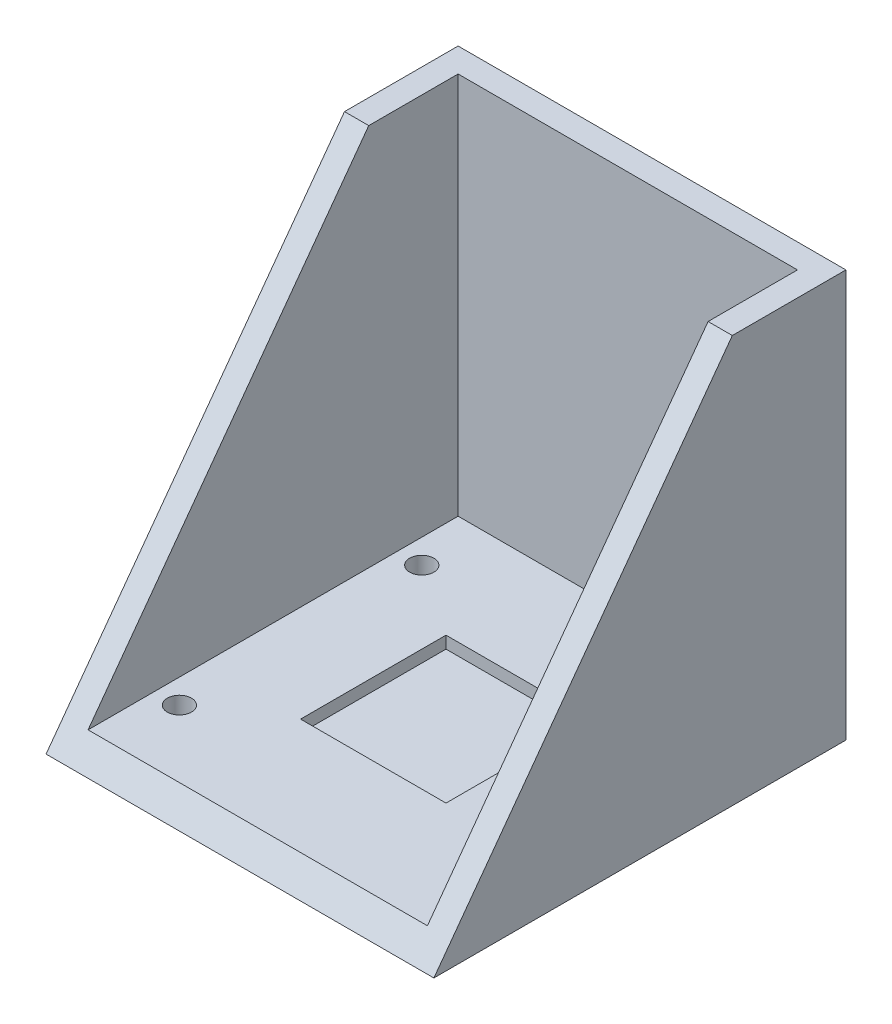
ISO-10303-21;
HEADER;
FILE_DESCRIPTION(('STEP AP214'),'2;1');
FILE_NAME('part.step','',(''),(''),'','','');
FILE_SCHEMA(('AUTOMOTIVE_DESIGN { 1 0 10303 214 1 1 1 1 }'));
ENDSEC;
DATA;
#1=APPLICATION_CONTEXT('core data for automotive mechanical design processes');
#2=APPLICATION_PROTOCOL_DEFINITION('international standard','automotive_design',2000,#1);
#3=PRODUCT_CONTEXT('',#1,'mechanical');
#4=PRODUCT('Part','Part','',(#3));
#5=PRODUCT_RELATED_PRODUCT_CATEGORY('part','',(#4));
#6=PRODUCT_DEFINITION_FORMATION('','',#4);
#7=PRODUCT_DEFINITION_CONTEXT('part definition',#1,'design');
#8=PRODUCT_DEFINITION('design','',#6,#7);
#9=PRODUCT_DEFINITION_SHAPE('','',#8);
#10=(LENGTH_UNIT() NAMED_UNIT(*) SI_UNIT(.MILLI.,.METRE.));
#11=(NAMED_UNIT(*) PLANE_ANGLE_UNIT() SI_UNIT($,.RADIAN.));
#12=(NAMED_UNIT(*) SI_UNIT($,.STERADIAN.) SOLID_ANGLE_UNIT());
#13=UNCERTAINTY_MEASURE_WITH_UNIT(LENGTH_MEASURE(1.E-05),#10,'distance_accuracy_value','');
#14=(GEOMETRIC_REPRESENTATION_CONTEXT(3) GLOBAL_UNCERTAINTY_ASSIGNED_CONTEXT((#13)) GLOBAL_UNIT_ASSIGNED_CONTEXT((#10,
#11,#12)) REPRESENTATION_CONTEXT('',''));
#15=CARTESIAN_POINT('',(0.,0.,0.));
#16=DIRECTION('',(0.,0.,1.));
#17=DIRECTION('',(1.,0.,0.));
#18=AXIS2_PLACEMENT_3D('',#15,#16,#17);
#19=CARTESIAN_POINT('',(0.,213.36,0.));
#20=DIRECTION('',(0.,-1.,0.));
#21=DIRECTION('',(0.,0.,-1.));
#22=AXIS2_PLACEMENT_3D('',#19,#20,#21);
#23=PLANE('',#22);
#24=DIRECTION('',(0.,0.,1.));
#25=VECTOR('',#24,1.);
#26=CARTESIAN_POINT('',(-101.6,213.36,107.95));
#27=LINE('',#26,#25);
#28=CARTESIAN_POINT('',(-101.6,213.36,-107.95));
#29=VERTEX_POINT('',#28);
#30=CARTESIAN_POINT('',(-101.6,213.36,-48.4218480796323));
#31=VERTEX_POINT('',#30);
#32=EDGE_CURVE('E151',#29,#31,#27,.T.);
#33=ORIENTED_EDGE('',*,*,#32,.T.);
#34=DIRECTION('',(1.,0.,0.));
#35=VECTOR('',#34,1.);
#36=CARTESIAN_POINT('',(-101.6,213.36,-48.4218480796323));
#37=LINE('',#36,#35);
#38=CARTESIAN_POINT('',(-88.8999999999999,213.36,-48.4218480796323));
#39=VERTEX_POINT('',#38);
#40=EDGE_CURVE('E125',#31,#39,#37,.T.);
#41=ORIENTED_EDGE('',*,*,#40,.T.);
#42=DIRECTION('',(0.,0.,1.));
#43=VECTOR('',#42,1.);
#44=CARTESIAN_POINT('',(-88.8999999999999,213.36,0.));
#45=LINE('',#44,#43);
#46=CARTESIAN_POINT('',(-88.8999999999999,213.36,-95.25));
#47=VERTEX_POINT('',#46);
#48=EDGE_CURVE('E167',#47,#39,#45,.T.);
#49=ORIENTED_EDGE('',*,*,#48,.F.);
#50=DIRECTION('',(-1.,0.,0.));
#51=VECTOR('',#50,1.);
#52=CARTESIAN_POINT('',(0.,213.36,-95.25));
#53=LINE('',#52,#51);
#54=CARTESIAN_POINT('',(88.9,213.36,-95.25));
#55=VERTEX_POINT('',#54);
#56=EDGE_CURVE('E170',#55,#47,#53,.T.);
#57=ORIENTED_EDGE('',*,*,#56,.F.);
#58=DIRECTION('',(0.,0.,-1.));
#59=VECTOR('',#58,1.);
#60=CARTESIAN_POINT('',(88.9,213.36,0.));
#61=LINE('',#60,#59);
#62=CARTESIAN_POINT('',(88.9,213.36,-48.4218480796323));
#63=VERTEX_POINT('',#62);
#64=EDGE_CURVE('E173',#63,#55,#61,.T.);
#65=ORIENTED_EDGE('',*,*,#64,.F.);
#66=CARTESIAN_POINT('',(101.6,213.36,-48.4218480796323));
#67=VERTEX_POINT('',#66);
#68=EDGE_CURVE('E129',#63,#67,#37,.T.);
#69=ORIENTED_EDGE('',*,*,#68,.T.);
#70=DIRECTION('',(0.,0.,-1.));
#71=VECTOR('',#70,1.);
#72=CARTESIAN_POINT('',(101.6,213.36,107.95));
#73=LINE('',#72,#71);
#74=CARTESIAN_POINT('',(101.6,213.36,-107.95));
#75=VERTEX_POINT('',#74);
#76=EDGE_CURVE('E145',#67,#75,#73,.T.);
#77=ORIENTED_EDGE('',*,*,#76,.T.);
#78=DIRECTION('',(-1.,0.,0.));
#79=VECTOR('',#78,1.);
#80=CARTESIAN_POINT('',(-101.6,213.36,-107.95));
#81=LINE('',#80,#79);
#82=EDGE_CURVE('E147',#75,#29,#81,.T.);
#83=ORIENTED_EDGE('',*,*,#82,.T.);
#84=EDGE_LOOP('',(#33,#41,#49,#57,#65,#69,#77,#83));
#85=FACE_BOUND('',#84,.T.);
#86=ADVANCED_FACE('F32',(#85),#23,.F.);
#87=CARTESIAN_POINT('',(101.6,213.36,107.95));
#88=DIRECTION('',(-1.,0.,0.));
#89=DIRECTION('',(0.,0.,1.));
#90=AXIS2_PLACEMENT_3D('',#87,#88,#89);
#91=PLANE('',#90);
#92=ORIENTED_EDGE('',*,*,#76,.F.);
#93=DIRECTION('',(0.,0.806571091671892,-0.591137102607519));
#94=VECTOR('',#93,1.);
#95=CARTESIAN_POINT('',(101.6,213.36,-48.4218480796323));
#96=LINE('',#95,#94);
#97=CARTESIAN_POINT('',(101.6,0.,107.95));
#98=VERTEX_POINT('',#97);
#99=EDGE_CURVE('E130',#98,#67,#96,.T.);
#100=ORIENTED_EDGE('',*,*,#99,.F.);
#101=DIRECTION('',(0.,0.,-1.));
#102=VECTOR('',#101,1.);
#103=CARTESIAN_POINT('',(101.6,0.,107.95));
#104=LINE('',#103,#102);
#105=CARTESIAN_POINT('',(101.6,0.,-107.95));
#106=VERTEX_POINT('',#105);
#107=EDGE_CURVE('E144',#98,#106,#104,.T.);
#108=ORIENTED_EDGE('',*,*,#107,.T.);
#109=DIRECTION('',(0.,-1.,0.));
#110=VECTOR('',#109,1.);
#111=CARTESIAN_POINT('',(101.6,213.36,-107.95));
#112=LINE('',#111,#110);
#113=EDGE_CURVE('E40',#75,#106,#112,.T.);
#114=ORIENTED_EDGE('',*,*,#113,.F.);
#115=EDGE_LOOP('',(#92,#100,#108,#114));
#116=FACE_BOUND('',#115,.T.);
#117=ADVANCED_FACE('F34',(#116),#91,.F.);
#118=CARTESIAN_POINT('',(-101.6,213.36,-107.95));
#119=DIRECTION('',(0.,0.,1.));
#120=DIRECTION('',(1.,0.,0.));
#121=AXIS2_PLACEMENT_3D('',#118,#119,#120);
#122=PLANE('',#121);
#123=DIRECTION('',(-1.,0.,0.));
#124=VECTOR('',#123,1.);
#125=CARTESIAN_POINT('',(-101.6,0.,-107.95));
#126=LINE('',#125,#124);
#127=CARTESIAN_POINT('',(-101.6,0.,-107.95));
#128=VERTEX_POINT('',#127);
#129=EDGE_CURVE('E139',#106,#128,#126,.T.);
#130=ORIENTED_EDGE('',*,*,#129,.T.);
#131=DIRECTION('',(0.,-1.,0.));
#132=VECTOR('',#131,1.);
#133=CARTESIAN_POINT('',(-101.6,213.36,-107.95));
#134=LINE('',#133,#132);
#135=EDGE_CURVE('E137',#29,#128,#134,.T.);
#136=ORIENTED_EDGE('',*,*,#135,.F.);
#137=ORIENTED_EDGE('',*,*,#82,.F.);
#138=ORIENTED_EDGE('',*,*,#113,.T.);
#139=EDGE_LOOP('',(#130,#136,#137,#138));
#140=FACE_BOUND('',#139,.T.);
#141=ADVANCED_FACE('F156',(#140),#122,.F.);
#142=CARTESIAN_POINT('',(-101.6,213.36,107.95));
#143=DIRECTION('',(1.,0.,0.));
#144=DIRECTION('',(0.,0.,-1.));
#145=AXIS2_PLACEMENT_3D('',#142,#143,#144);
#146=PLANE('',#145);
#147=DIRECTION('',(0.,0.,1.));
#148=VECTOR('',#147,1.);
#149=CARTESIAN_POINT('',(-101.6,0.,107.95));
#150=LINE('',#149,#148);
#151=CARTESIAN_POINT('',(-101.6,0.,107.95));
#152=VERTEX_POINT('',#151);
#153=EDGE_CURVE('E134',#128,#152,#150,.T.);
#154=ORIENTED_EDGE('',*,*,#153,.T.);
#155=DIRECTION('',(0.,0.806571091671892,-0.591137102607519));
#156=VECTOR('',#155,1.);
#157=CARTESIAN_POINT('',(-101.6,213.36,-48.4218480796323));
#158=LINE('',#157,#156);
#159=EDGE_CURVE('E118',#152,#31,#158,.T.);
#160=ORIENTED_EDGE('',*,*,#159,.T.);
#161=ORIENTED_EDGE('',*,*,#32,.F.);
#162=ORIENTED_EDGE('',*,*,#135,.T.);
#163=EDGE_LOOP('',(#154,#160,#161,#162));
#164=FACE_BOUND('',#163,.T.);
#165=ADVANCED_FACE('F135',(#164),#146,.F.);
#166=CARTESIAN_POINT('',(0.,0.,0.));
#167=DIRECTION('',(0.,-1.,0.));
#168=DIRECTION('',(0.,0.,-1.));
#169=AXIS2_PLACEMENT_3D('',#166,#167,#168);
#170=PLANE('',#169);
#171=CARTESIAN_POINT('',(76.2,0.,63.5));
#172=DIRECTION('',(0.,1.,0.));
#173=DIRECTION('',(0.,0.,1.));
#174=AXIS2_PLACEMENT_3D('',#171,#172,#173);
#175=CIRCLE('',#174,6.35);
#176=CARTESIAN_POINT('',(76.2,0.,69.85));
#177=VERTEX_POINT('',#176);
#178=EDGE_CURVE('E230',#177,#177,#175,.T.);
#179=ORIENTED_EDGE('',*,*,#178,.T.);
#180=EDGE_LOOP('',(#179));
#181=FACE_BOUND('',#180,.T.);
#182=CARTESIAN_POINT('',(76.2,0.,-63.5));
#183=DIRECTION('',(0.,1.,0.));
#184=DIRECTION('',(0.,0.,1.));
#185=AXIS2_PLACEMENT_3D('',#182,#183,#184);
#186=CIRCLE('',#185,6.34999999999999);
#187=CARTESIAN_POINT('',(76.2,0.,-57.15));
#188=VERTEX_POINT('',#187);
#189=EDGE_CURVE('E224',#188,#188,#186,.T.);
#190=ORIENTED_EDGE('',*,*,#189,.T.);
#191=EDGE_LOOP('',(#190));
#192=FACE_BOUND('',#191,.T.);
#193=CARTESIAN_POINT('',(-76.2,0.,63.5));
#194=DIRECTION('',(0.,1.,0.));
#195=DIRECTION('',(0.,0.,1.));
#196=AXIS2_PLACEMENT_3D('',#193,#194,#195);
#197=CIRCLE('',#196,6.35);
#198=CARTESIAN_POINT('',(-76.2,0.,69.85));
#199=VERTEX_POINT('',#198);
#200=EDGE_CURVE('E218',#199,#199,#197,.T.);
#201=ORIENTED_EDGE('',*,*,#200,.T.);
#202=EDGE_LOOP('',(#201));
#203=FACE_BOUND('',#202,.T.);
#204=CARTESIAN_POINT('',(-76.2,0.,-63.5));
#205=DIRECTION('',(0.,1.,0.));
#206=DIRECTION('',(0.,0.,1.));
#207=AXIS2_PLACEMENT_3D('',#204,#205,#206);
#208=CIRCLE('',#207,6.34999999999999);
#209=CARTESIAN_POINT('',(-76.2,0.,-57.15));
#210=VERTEX_POINT('',#209);
#211=EDGE_CURVE('E204',#210,#210,#208,.T.);
#212=ORIENTED_EDGE('',*,*,#211,.T.);
#213=EDGE_LOOP('',(#212));
#214=FACE_BOUND('',#213,.T.);
#215=ORIENTED_EDGE('',*,*,#107,.F.);
#216=DIRECTION('',(1.,0.,0.));
#217=VECTOR('',#216,1.);
#218=CARTESIAN_POINT('',(-101.6,0.,107.95));
#219=LINE('',#218,#217);
#220=EDGE_CURVE('E122',#152,#98,#219,.T.);
#221=ORIENTED_EDGE('',*,*,#220,.F.);
#222=ORIENTED_EDGE('',*,*,#153,.F.);
#223=ORIENTED_EDGE('',*,*,#129,.F.);
#224=EDGE_LOOP('',(#215,#221,#222,#223));
#225=FACE_BOUND('',#224,.T.);
#226=ADVANCED_FACE('F142',(#181,#192,#203,#214,#225),#170,.T.);
#227=CARTESIAN_POINT('',(88.9,213.36,107.95));
#228=DIRECTION('',(-1.,0.,0.));
#229=DIRECTION('',(0.,0.,1.));
#230=AXIS2_PLACEMENT_3D('',#227,#228,#229);
#231=PLANE('',#230);
#232=DIRECTION('',(0.,-0.806571091671892,0.591137102607519));
#233=VECTOR('',#232,1.);
#234=CARTESIAN_POINT('',(88.9,138.802825714459,6.22121121276199));
#235=LINE('',#234,#233);
#236=CARTESIAN_POINT('',(88.9,12.7,98.6421519000219));
#237=VERTEX_POINT('',#236);
#238=EDGE_CURVE('E47',#63,#237,#235,.T.);
#239=ORIENTED_EDGE('',*,*,#238,.F.);
#240=ORIENTED_EDGE('',*,*,#64,.T.);
#241=DIRECTION('',(0.,-1.,0.));
#242=VECTOR('',#241,1.);
#243=CARTESIAN_POINT('',(88.9,213.36,-95.25));
#244=LINE('',#243,#242);
#245=CARTESIAN_POINT('',(88.9,12.7,-95.25));
#246=VERTEX_POINT('',#245);
#247=EDGE_CURVE('E159',#55,#246,#244,.T.);
#248=ORIENTED_EDGE('',*,*,#247,.T.);
#249=DIRECTION('',(0.,0.,-1.));
#250=VECTOR('',#249,1.);
#251=CARTESIAN_POINT('',(88.9,12.7,0.));
#252=LINE('',#251,#250);
#253=EDGE_CURVE('E181',#237,#246,#252,.T.);
#254=ORIENTED_EDGE('',*,*,#253,.F.);
#255=EDGE_LOOP('',(#239,#240,#248,#254));
#256=FACE_BOUND('',#255,.T.);
#257=ADVANCED_FACE('F249',(#256),#231,.T.);
#258=CARTESIAN_POINT('',(-101.6,213.36,-95.25));
#259=DIRECTION('',(0.,0.,1.));
#260=DIRECTION('',(1.,0.,0.));
#261=AXIS2_PLACEMENT_3D('',#258,#259,#260);
#262=PLANE('',#261);
#263=DIRECTION('',(-1.,0.,0.));
#264=VECTOR('',#263,1.);
#265=CARTESIAN_POINT('',(0.,12.7,-95.25));
#266=LINE('',#265,#264);
#267=CARTESIAN_POINT('',(-88.8999999999999,12.7,-95.25));
#268=VERTEX_POINT('',#267);
#269=EDGE_CURVE('E178',#246,#268,#266,.T.);
#270=ORIENTED_EDGE('',*,*,#269,.F.);
#271=ORIENTED_EDGE('',*,*,#247,.F.);
#272=ORIENTED_EDGE('',*,*,#56,.T.);
#273=DIRECTION('',(0.,-1.,0.));
#274=VECTOR('',#273,1.);
#275=CARTESIAN_POINT('',(-88.8999999999999,213.36,-95.25));
#276=LINE('',#275,#274);
#277=EDGE_CURVE('E162',#47,#268,#276,.T.);
#278=ORIENTED_EDGE('',*,*,#277,.T.);
#279=EDGE_LOOP('',(#270,#271,#272,#278));
#280=FACE_BOUND('',#279,.T.);
#281=ADVANCED_FACE('F253',(#280),#262,.T.);
#282=CARTESIAN_POINT('',(-88.8999999999999,213.36,107.95));
#283=DIRECTION('',(1.,0.,0.));
#284=DIRECTION('',(0.,0.,-1.));
#285=AXIS2_PLACEMENT_3D('',#282,#283,#284);
#286=PLANE('',#285);
#287=DIRECTION('',(0.,0.806571091671892,-0.591137102607519));
#288=VECTOR('',#287,1.);
#289=CARTESIAN_POINT('',(-88.8999999999999,138.802825714459,6.22121121276199));
#290=LINE('',#289,#288);
#291=CARTESIAN_POINT('',(-88.8999999999999,12.7,98.6421519000219));
#292=VERTEX_POINT('',#291);
#293=EDGE_CURVE('E239',#292,#39,#290,.T.);
#294=ORIENTED_EDGE('',*,*,#293,.F.);
#295=DIRECTION('',(0.,0.,1.));
#296=VECTOR('',#295,1.);
#297=CARTESIAN_POINT('',(-88.8999999999999,12.7,0.));
#298=LINE('',#297,#296);
#299=EDGE_CURVE('E175',#268,#292,#298,.T.);
#300=ORIENTED_EDGE('',*,*,#299,.F.);
#301=ORIENTED_EDGE('',*,*,#277,.F.);
#302=ORIENTED_EDGE('',*,*,#48,.T.);
#303=EDGE_LOOP('',(#294,#300,#301,#302));
#304=FACE_BOUND('',#303,.T.);
#305=ADVANCED_FACE('F259',(#304),#286,.T.);
#306=CARTESIAN_POINT('',(0.,12.7,0.));
#307=DIRECTION('',(0.,-1.,0.));
#308=DIRECTION('',(0.,0.,-1.));
#309=AXIS2_PLACEMENT_3D('',#306,#307,#308);
#310=PLANE('',#309);
#311=CARTESIAN_POINT('',(76.2,12.7,63.5));
#312=DIRECTION('',(0.,1.,0.));
#313=DIRECTION('',(0.,0.,1.));
#314=AXIS2_PLACEMENT_3D('',#311,#312,#313);
#315=CIRCLE('',#314,6.35);
#316=CARTESIAN_POINT('',(76.2,12.7,69.85));
#317=VERTEX_POINT('',#316);
#318=EDGE_CURVE('E233',#317,#317,#315,.T.);
#319=ORIENTED_EDGE('',*,*,#318,.F.);
#320=EDGE_LOOP('',(#319));
#321=FACE_BOUND('',#320,.T.);
#322=CARTESIAN_POINT('',(76.2,12.7,-63.5));
#323=DIRECTION('',(0.,1.,0.));
#324=DIRECTION('',(0.,0.,1.));
#325=AXIS2_PLACEMENT_3D('',#322,#323,#324);
#326=CIRCLE('',#325,6.34999999999999);
#327=CARTESIAN_POINT('',(76.2,12.7,-57.15));
#328=VERTEX_POINT('',#327);
#329=EDGE_CURVE('E227',#328,#328,#326,.T.);
#330=ORIENTED_EDGE('',*,*,#329,.F.);
#331=EDGE_LOOP('',(#330));
#332=FACE_BOUND('',#331,.T.);
#333=CARTESIAN_POINT('',(-76.2,12.7,63.5));
#334=DIRECTION('',(0.,1.,0.));
#335=DIRECTION('',(0.,0.,1.));
#336=AXIS2_PLACEMENT_3D('',#333,#334,#335);
#337=CIRCLE('',#336,6.35);
#338=CARTESIAN_POINT('',(-76.2,12.7,69.85));
#339=VERTEX_POINT('',#338);
#340=EDGE_CURVE('E221',#339,#339,#337,.T.);
#341=ORIENTED_EDGE('',*,*,#340,.F.);
#342=EDGE_LOOP('',(#341));
#343=FACE_BOUND('',#342,.T.);
#344=CARTESIAN_POINT('',(-76.2,12.7,-63.5));
#345=DIRECTION('',(0.,1.,0.));
#346=DIRECTION('',(0.,0.,1.));
#347=AXIS2_PLACEMENT_3D('',#344,#345,#346);
#348=CIRCLE('',#347,6.34999999999999);
#349=CARTESIAN_POINT('',(-76.2,12.7,-57.15));
#350=VERTEX_POINT('',#349);
#351=EDGE_CURVE('E215',#350,#350,#348,.T.);
#352=ORIENTED_EDGE('',*,*,#351,.F.);
#353=EDGE_LOOP('',(#352));
#354=FACE_BOUND('',#353,.T.);
#355=DIRECTION('',(-1.,0.,0.));
#356=VECTOR('',#355,1.);
#357=CARTESIAN_POINT('',(-38.1,12.7,-38.1));
#358=LINE('',#357,#356);
#359=CARTESIAN_POINT('',(38.1,12.7,-38.1));
#360=VERTEX_POINT('',#359);
#361=CARTESIAN_POINT('',(-38.1,12.7,-38.1));
#362=VERTEX_POINT('',#361);
#363=EDGE_CURVE('E200',#360,#362,#358,.T.);
#364=ORIENTED_EDGE('',*,*,#363,.F.);
#365=DIRECTION('',(0.,0.,-1.));
#366=VECTOR('',#365,1.);
#367=CARTESIAN_POINT('',(38.1,12.7,38.1));
#368=LINE('',#367,#366);
#369=CARTESIAN_POINT('',(38.1,12.7,38.1));
#370=VERTEX_POINT('',#369);
#371=EDGE_CURVE('E54',#370,#360,#368,.T.);
#372=ORIENTED_EDGE('',*,*,#371,.F.);
#373=DIRECTION('',(1.,0.,0.));
#374=VECTOR('',#373,1.);
#375=CARTESIAN_POINT('',(-38.1,12.7,38.1));
#376=LINE('',#375,#374);
#377=CARTESIAN_POINT('',(-38.1,12.7,38.1));
#378=VERTEX_POINT('',#377);
#379=EDGE_CURVE('E193',#378,#370,#376,.T.);
#380=ORIENTED_EDGE('',*,*,#379,.F.);
#381=DIRECTION('',(0.,0.,1.));
#382=VECTOR('',#381,1.);
#383=CARTESIAN_POINT('',(-38.1,12.7,38.1));
#384=LINE('',#383,#382);
#385=EDGE_CURVE('E197',#362,#378,#384,.T.);
#386=ORIENTED_EDGE('',*,*,#385,.F.);
#387=EDGE_LOOP('',(#364,#372,#380,#386));
#388=FACE_BOUND('',#387,.T.);
#389=ORIENTED_EDGE('',*,*,#299,.T.);
#390=DIRECTION('',(1.,0.,0.));
#391=VECTOR('',#390,1.);
#392=CARTESIAN_POINT('',(0.,12.7,98.6421519000219));
#393=LINE('',#392,#391);
#394=EDGE_CURVE('E11',#292,#237,#393,.T.);
#395=ORIENTED_EDGE('',*,*,#394,.T.);
#396=ORIENTED_EDGE('',*,*,#253,.T.);
#397=ORIENTED_EDGE('',*,*,#269,.T.);
#398=EDGE_LOOP('',(#389,#395,#396,#397));
#399=FACE_BOUND('',#398,.T.);
#400=ADVANCED_FACE('F256',(#321,#332,#343,#354,#388,#399),#310,.F.);
#401=CARTESIAN_POINT('',(38.1,6.35,38.1));
#402=DIRECTION('',(1.,0.,0.));
#403=DIRECTION('',(0.,0.,-1.));
#404=AXIS2_PLACEMENT_3D('',#401,#402,#403);
#405=PLANE('',#404);
#406=ORIENTED_EDGE('',*,*,#371,.T.);
#407=DIRECTION('',(0.,1.,0.));
#408=VECTOR('',#407,1.);
#409=CARTESIAN_POINT('',(38.1,6.35,-38.1));
#410=LINE('',#409,#408);
#411=CARTESIAN_POINT('',(38.1,6.35,-38.1));
#412=VERTEX_POINT('',#411);
#413=EDGE_CURVE('E185',#412,#360,#410,.T.);
#414=ORIENTED_EDGE('',*,*,#413,.F.);
#415=DIRECTION('',(0.,0.,-1.));
#416=VECTOR('',#415,1.);
#417=CARTESIAN_POINT('',(38.1,6.35,38.1));
#418=LINE('',#417,#416);
#419=CARTESIAN_POINT('',(38.1,6.35,38.1));
#420=VERTEX_POINT('',#419);
#421=EDGE_CURVE('E196',#420,#412,#418,.T.);
#422=ORIENTED_EDGE('',*,*,#421,.F.);
#423=DIRECTION('',(0.,1.,0.));
#424=VECTOR('',#423,1.);
#425=CARTESIAN_POINT('',(38.1,6.35,38.1));
#426=LINE('',#425,#424);
#427=EDGE_CURVE('E184',#420,#370,#426,.T.);
#428=ORIENTED_EDGE('',*,*,#427,.T.);
#429=EDGE_LOOP('',(#406,#414,#422,#428));
#430=FACE_BOUND('',#429,.T.);
#431=ADVANCED_FACE('F266',(#430),#405,.F.);
#432=CARTESIAN_POINT('',(-38.1,6.35,38.1));
#433=DIRECTION('',(0.,0.,1.));
#434=DIRECTION('',(1.,0.,0.));
#435=AXIS2_PLACEMENT_3D('',#432,#433,#434);
#436=PLANE('',#435);
#437=ORIENTED_EDGE('',*,*,#379,.T.);
#438=ORIENTED_EDGE('',*,*,#427,.F.);
#439=DIRECTION('',(1.,0.,0.));
#440=VECTOR('',#439,1.);
#441=CARTESIAN_POINT('',(-38.1,6.35,38.1));
#442=LINE('',#441,#440);
#443=CARTESIAN_POINT('',(-38.1,6.35,38.1));
#444=VERTEX_POINT('',#443);
#445=EDGE_CURVE('E188',#444,#420,#442,.T.);
#446=ORIENTED_EDGE('',*,*,#445,.F.);
#447=DIRECTION('',(0.,1.,0.));
#448=VECTOR('',#447,1.);
#449=CARTESIAN_POINT('',(-38.1,6.35,38.1));
#450=LINE('',#449,#448);
#451=EDGE_CURVE('E190',#444,#378,#450,.T.);
#452=ORIENTED_EDGE('',*,*,#451,.T.);
#453=EDGE_LOOP('',(#437,#438,#446,#452));
#454=FACE_BOUND('',#453,.T.);
#455=ADVANCED_FACE('F313',(#454),#436,.F.);
#456=CARTESIAN_POINT('',(-38.1,6.35,38.1));
#457=DIRECTION('',(-1.,0.,0.));
#458=DIRECTION('',(0.,0.,1.));
#459=AXIS2_PLACEMENT_3D('',#456,#457,#458);
#460=PLANE('',#459);
#461=ORIENTED_EDGE('',*,*,#385,.T.);
#462=ORIENTED_EDGE('',*,*,#451,.F.);
#463=DIRECTION('',(0.,0.,1.));
#464=VECTOR('',#463,1.);
#465=CARTESIAN_POINT('',(-38.1,6.35,38.1));
#466=LINE('',#465,#464);
#467=CARTESIAN_POINT('',(-38.1,6.35,-38.1));
#468=VERTEX_POINT('',#467);
#469=EDGE_CURVE('E207',#468,#444,#466,.T.);
#470=ORIENTED_EDGE('',*,*,#469,.F.);
#471=DIRECTION('',(0.,1.,0.));
#472=VECTOR('',#471,1.);
#473=CARTESIAN_POINT('',(-38.1,6.35,-38.1));
#474=LINE('',#473,#472);
#475=EDGE_CURVE('E187',#468,#362,#474,.T.);
#476=ORIENTED_EDGE('',*,*,#475,.T.);
#477=EDGE_LOOP('',(#461,#462,#470,#476));
#478=FACE_BOUND('',#477,.T.);
#479=ADVANCED_FACE('F323',(#478),#460,.F.);
#480=CARTESIAN_POINT('',(-38.1,6.35,-38.1));
#481=DIRECTION('',(0.,0.,-1.));
#482=DIRECTION('',(-1.,0.,0.));
#483=AXIS2_PLACEMENT_3D('',#480,#481,#482);
#484=PLANE('',#483);
#485=ORIENTED_EDGE('',*,*,#363,.T.);
#486=ORIENTED_EDGE('',*,*,#475,.F.);
#487=DIRECTION('',(-1.,0.,0.));
#488=VECTOR('',#487,1.);
#489=CARTESIAN_POINT('',(-38.1,6.35,-38.1));
#490=LINE('',#489,#488);
#491=EDGE_CURVE('E210',#412,#468,#490,.T.);
#492=ORIENTED_EDGE('',*,*,#491,.F.);
#493=ORIENTED_EDGE('',*,*,#413,.T.);
#494=EDGE_LOOP('',(#485,#486,#492,#493));
#495=FACE_BOUND('',#494,.T.);
#496=ADVANCED_FACE('F333',(#495),#484,.F.);
#497=CARTESIAN_POINT('',(0.,6.35,0.));
#498=DIRECTION('',(0.,-1.,0.));
#499=DIRECTION('',(0.,0.,-1.));
#500=AXIS2_PLACEMENT_3D('',#497,#498,#499);
#501=PLANE('',#500);
#502=ORIENTED_EDGE('',*,*,#421,.T.);
#503=ORIENTED_EDGE('',*,*,#491,.T.);
#504=ORIENTED_EDGE('',*,*,#469,.T.);
#505=ORIENTED_EDGE('',*,*,#445,.T.);
#506=EDGE_LOOP('',(#502,#503,#504,#505));
#507=FACE_BOUND('',#506,.T.);
#508=ADVANCED_FACE('F343',(#507),#501,.F.);
#509=CARTESIAN_POINT('',(-76.2,0.,-63.5));
#510=DIRECTION('',(0.,1.,0.));
#511=DIRECTION('',(0.,0.,1.));
#512=AXIS2_PLACEMENT_3D('',#509,#510,#511);
#513=CYLINDRICAL_SURFACE('',#512,6.34999999999999);
#514=ORIENTED_EDGE('',*,*,#211,.F.);
#515=EDGE_LOOP('',(#514));
#516=FACE_BOUND('',#515,.T.);
#517=ORIENTED_EDGE('',*,*,#351,.T.);
#518=EDGE_LOOP('',(#517));
#519=FACE_BOUND('',#518,.T.);
#520=ADVANCED_FACE('F353',(#516,#519),#513,.F.);
#521=CARTESIAN_POINT('',(-76.2,0.,63.5));
#522=DIRECTION('',(0.,1.,0.));
#523=DIRECTION('',(0.,0.,1.));
#524=AXIS2_PLACEMENT_3D('',#521,#522,#523);
#525=CYLINDRICAL_SURFACE('',#524,6.35);
#526=ORIENTED_EDGE('',*,*,#200,.F.);
#527=EDGE_LOOP('',(#526));
#528=FACE_BOUND('',#527,.T.);
#529=ORIENTED_EDGE('',*,*,#340,.T.);
#530=EDGE_LOOP('',(#529));
#531=FACE_BOUND('',#530,.T.);
#532=ADVANCED_FACE('F363',(#528,#531),#525,.F.);
#533=CARTESIAN_POINT('',(76.2,0.,-63.5));
#534=DIRECTION('',(0.,1.,0.));
#535=DIRECTION('',(0.,0.,1.));
#536=AXIS2_PLACEMENT_3D('',#533,#534,#535);
#537=CYLINDRICAL_SURFACE('',#536,6.34999999999999);
#538=ORIENTED_EDGE('',*,*,#189,.F.);
#539=EDGE_LOOP('',(#538));
#540=FACE_BOUND('',#539,.T.);
#541=ORIENTED_EDGE('',*,*,#329,.T.);
#542=EDGE_LOOP('',(#541));
#543=FACE_BOUND('',#542,.T.);
#544=ADVANCED_FACE('F373',(#540,#543),#537,.F.);
#545=CARTESIAN_POINT('',(76.2,0.,63.5));
#546=DIRECTION('',(0.,1.,0.));
#547=DIRECTION('',(0.,0.,1.));
#548=AXIS2_PLACEMENT_3D('',#545,#546,#547);
#549=CYLINDRICAL_SURFACE('',#548,6.35);
#550=ORIENTED_EDGE('',*,*,#178,.F.);
#551=EDGE_LOOP('',(#550));
#552=FACE_BOUND('',#551,.T.);
#553=ORIENTED_EDGE('',*,*,#318,.T.);
#554=EDGE_LOOP('',(#553));
#555=FACE_BOUND('',#554,.T.);
#556=ADVANCED_FACE('F383',(#552,#555),#549,.F.);
#557=CARTESIAN_POINT('',(-101.6,213.36,-48.4218480796323));
#558=DIRECTION('',(0.,-0.591137102607519,-0.806571091671892));
#559=DIRECTION('',(0.,0.806571091671892,-0.591137102607519));
#560=AXIS2_PLACEMENT_3D('',#557,#558,#559);
#561=PLANE('',#560);
#562=ORIENTED_EDGE('',*,*,#238,.T.);
#563=ORIENTED_EDGE('',*,*,#394,.F.);
#564=ORIENTED_EDGE('',*,*,#293,.T.);
#565=ORIENTED_EDGE('',*,*,#40,.F.);
#566=ORIENTED_EDGE('',*,*,#159,.F.);
#567=ORIENTED_EDGE('',*,*,#220,.T.);
#568=ORIENTED_EDGE('',*,*,#99,.T.);
#569=ORIENTED_EDGE('',*,*,#68,.F.);
#570=EDGE_LOOP('',(#562,#563,#564,#565,#566,#567,#568,#569));
#571=FACE_BOUND('',#570,.T.);
#572=ADVANCED_FACE('F120',(#571),#561,.F.);
#573=CLOSED_SHELL('',(#86,#117,#141,#165,#226,#257,#281,#305,#400,#431,#455,#479,#496,#508,#520,
#532,#544,#556,#572));
#574=MANIFOLD_SOLID_BREP('B2',#573);
#575=ADVANCED_BREP_SHAPE_REPRESENTATION('',(#18,#574),#14);
#576=SHAPE_DEFINITION_REPRESENTATION(#9,#575);
ENDSEC;
END-ISO-10303-21;
